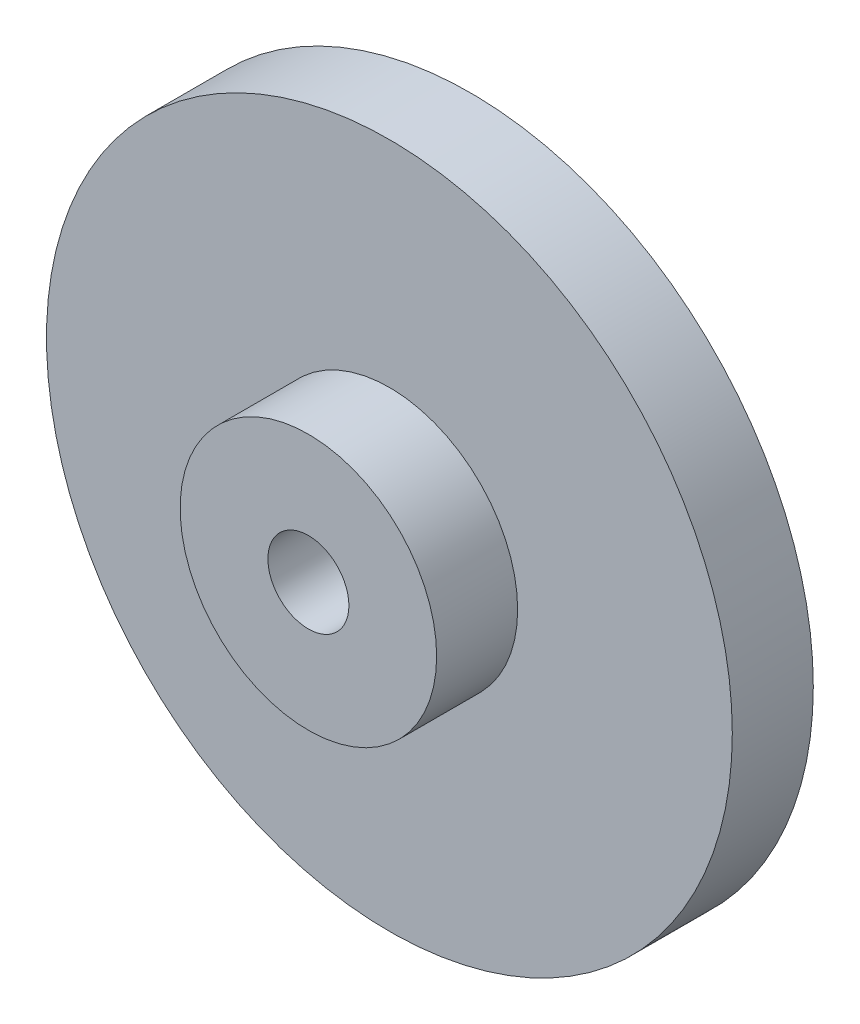
ISO-10303-21;
HEADER;
FILE_DESCRIPTION(('STEP AP214'),'2;1');
FILE_NAME('part.step','',(''),(''),'','','');
FILE_SCHEMA(('AUTOMOTIVE_DESIGN { 1 0 10303 214 1 1 1 1 }'));
ENDSEC;
DATA;
#1=APPLICATION_CONTEXT('core data for automotive mechanical design processes');
#2=APPLICATION_PROTOCOL_DEFINITION('international standard','automotive_design',2000,#1);
#3=PRODUCT_CONTEXT('',#1,'mechanical');
#4=PRODUCT('Part','Part','',(#3));
#5=PRODUCT_RELATED_PRODUCT_CATEGORY('part','',(#4));
#6=PRODUCT_DEFINITION_FORMATION('','',#4);
#7=PRODUCT_DEFINITION_CONTEXT('part definition',#1,'design');
#8=PRODUCT_DEFINITION('design','',#6,#7);
#9=PRODUCT_DEFINITION_SHAPE('','',#8);
#10=(LENGTH_UNIT() NAMED_UNIT(*) SI_UNIT(.MILLI.,.METRE.));
#11=(NAMED_UNIT(*) PLANE_ANGLE_UNIT() SI_UNIT($,.RADIAN.));
#12=(NAMED_UNIT(*) SI_UNIT($,.STERADIAN.) SOLID_ANGLE_UNIT());
#13=UNCERTAINTY_MEASURE_WITH_UNIT(LENGTH_MEASURE(1.E-05),#10,'distance_accuracy_value','');
#14=(GEOMETRIC_REPRESENTATION_CONTEXT(3) GLOBAL_UNCERTAINTY_ASSIGNED_CONTEXT((#13)) GLOBAL_UNIT_ASSIGNED_CONTEXT((#10,
#11,#12)) REPRESENTATION_CONTEXT('',''));
#15=CARTESIAN_POINT('',(0.,0.,0.));
#16=DIRECTION('',(0.,0.,1.));
#17=DIRECTION('',(1.,0.,0.));
#18=AXIS2_PLACEMENT_3D('',#15,#16,#17);
#19=CARTESIAN_POINT('',(0.,0.,6.));
#20=DIRECTION('',(0.,0.,-1.));
#21=DIRECTION('',(-1.,0.,0.));
#22=AXIS2_PLACEMENT_3D('',#19,#20,#21);
#23=CYLINDRICAL_SURFACE('',#22,25.4);
#24=CARTESIAN_POINT('',(0.,0.,6.));
#25=DIRECTION('',(0.,0.,1.));
#26=DIRECTION('',(1.,0.,0.));
#27=AXIS2_PLACEMENT_3D('',#24,#25,#26);
#28=CIRCLE('',#27,25.4);
#29=CARTESIAN_POINT('',(25.4,0.,6.));
#30=VERTEX_POINT('',#29);
#31=EDGE_CURVE('E38',#30,#30,#28,.T.);
#32=ORIENTED_EDGE('',*,*,#31,.F.);
#33=EDGE_LOOP('',(#32));
#34=FACE_BOUND('',#33,.T.);
#35=CARTESIAN_POINT('',(0.,0.,0.));
#36=DIRECTION('',(0.,0.,1.));
#37=DIRECTION('',(1.,0.,0.));
#38=AXIS2_PLACEMENT_3D('',#35,#36,#37);
#39=CIRCLE('',#38,25.4);
#40=CARTESIAN_POINT('',(25.4,0.,0.));
#41=VERTEX_POINT('',#40);
#42=EDGE_CURVE('E34',#41,#41,#39,.T.);
#43=ORIENTED_EDGE('',*,*,#42,.T.);
#44=EDGE_LOOP('',(#43));
#45=FACE_BOUND('',#44,.T.);
#46=ADVANCED_FACE('F31',(#34,#45),#23,.T.);
#47=CARTESIAN_POINT('',(0.,0.,6.));
#48=DIRECTION('',(0.,0.,1.));
#49=DIRECTION('',(1.,0.,0.));
#50=AXIS2_PLACEMENT_3D('',#47,#48,#49);
#51=PLANE('',#50);
#52=CARTESIAN_POINT('',(0.,0.,6.));
#53=DIRECTION('',(0.,0.,1.));
#54=DIRECTION('',(1.,0.,0.));
#55=AXIS2_PLACEMENT_3D('',#52,#53,#54);
#56=CIRCLE('',#55,9.5);
#57=CARTESIAN_POINT('',(9.5,0.,6.));
#58=VERTEX_POINT('',#57);
#59=EDGE_CURVE('E10',#58,#58,#56,.T.);
#60=ORIENTED_EDGE('',*,*,#59,.F.);
#61=EDGE_LOOP('',(#60));
#62=FACE_BOUND('',#61,.T.);
#63=ORIENTED_EDGE('',*,*,#31,.T.);
#64=EDGE_LOOP('',(#63));
#65=FACE_BOUND('',#64,.T.);
#66=ADVANCED_FACE('F69',(#62,#65),#51,.T.);
#67=CARTESIAN_POINT('',(0.,0.,0.));
#68=DIRECTION('',(0.,0.,1.));
#69=DIRECTION('',(1.,0.,0.));
#70=AXIS2_PLACEMENT_3D('',#67,#68,#69);
#71=PLANE('',#70);
#72=CARTESIAN_POINT('',(0.,0.,0.));
#73=DIRECTION('',(0.,0.,1.));
#74=DIRECTION('',(1.,0.,0.));
#75=AXIS2_PLACEMENT_3D('',#72,#73,#74);
#76=CIRCLE('',#75,3.);
#77=CARTESIAN_POINT('',(3.,0.,0.));
#78=VERTEX_POINT('',#77);
#79=EDGE_CURVE('E50',#78,#78,#76,.T.);
#80=ORIENTED_EDGE('',*,*,#79,.T.);
#81=EDGE_LOOP('',(#80));
#82=FACE_BOUND('',#81,.T.);
#83=ORIENTED_EDGE('',*,*,#42,.F.);
#84=EDGE_LOOP('',(#83));
#85=FACE_BOUND('',#84,.T.);
#86=ADVANCED_FACE('F54',(#82,#85),#71,.F.);
#87=CARTESIAN_POINT('',(0.,0.,12.));
#88=DIRECTION('',(0.,0.,-1.));
#89=DIRECTION('',(-1.,0.,0.));
#90=AXIS2_PLACEMENT_3D('',#87,#88,#89);
#91=CYLINDRICAL_SURFACE('',#90,9.5);
#92=CARTESIAN_POINT('',(0.,0.,12.));
#93=DIRECTION('',(0.,0.,1.));
#94=DIRECTION('',(1.,0.,0.));
#95=AXIS2_PLACEMENT_3D('',#92,#93,#94);
#96=CIRCLE('',#95,9.5);
#97=CARTESIAN_POINT('',(9.5,0.,12.));
#98=VERTEX_POINT('',#97);
#99=EDGE_CURVE('E44',#98,#98,#96,.T.);
#100=ORIENTED_EDGE('',*,*,#99,.F.);
#101=EDGE_LOOP('',(#100));
#102=FACE_BOUND('',#101,.T.);
#103=ORIENTED_EDGE('',*,*,#59,.T.);
#104=EDGE_LOOP('',(#103));
#105=FACE_BOUND('',#104,.T.);
#106=ADVANCED_FACE('F65',(#102,#105),#91,.T.);
#107=CARTESIAN_POINT('',(0.,0.,12.));
#108=DIRECTION('',(0.,0.,1.));
#109=DIRECTION('',(1.,0.,0.));
#110=AXIS2_PLACEMENT_3D('',#107,#108,#109);
#111=PLANE('',#110);
#112=CARTESIAN_POINT('',(0.,0.,12.));
#113=DIRECTION('',(0.,0.,1.));
#114=DIRECTION('',(1.,0.,0.));
#115=AXIS2_PLACEMENT_3D('',#112,#113,#114);
#116=CIRCLE('',#115,3.);
#117=CARTESIAN_POINT('',(3.,0.,12.));
#118=VERTEX_POINT('',#117);
#119=EDGE_CURVE('E47',#118,#118,#116,.T.);
#120=ORIENTED_EDGE('',*,*,#119,.F.);
#121=EDGE_LOOP('',(#120));
#122=FACE_BOUND('',#121,.T.);
#123=ORIENTED_EDGE('',*,*,#99,.T.);
#124=EDGE_LOOP('',(#123));
#125=FACE_BOUND('',#124,.T.);
#126=ADVANCED_FACE('F59',(#122,#125),#111,.T.);
#127=CARTESIAN_POINT('',(0.,0.,12.001));
#128=DIRECTION('',(0.,0.,-1.));
#129=DIRECTION('',(-1.,0.,0.));
#130=AXIS2_PLACEMENT_3D('',#127,#128,#129);
#131=CYLINDRICAL_SURFACE('',#130,3.);
#132=ORIENTED_EDGE('',*,*,#119,.T.);
#133=EDGE_LOOP('',(#132));
#134=FACE_BOUND('',#133,.T.);
#135=ORIENTED_EDGE('',*,*,#79,.F.);
#136=EDGE_LOOP('',(#135));
#137=FACE_BOUND('',#136,.T.);
#138=ADVANCED_FACE('F57',(#134,#137),#131,.F.);
#139=CLOSED_SHELL('',(#46,#66,#86,#106,#126,#138));
#140=MANIFOLD_SOLID_BREP('B2',#139);
#141=ADVANCED_BREP_SHAPE_REPRESENTATION('',(#18,#140),#14);
#142=SHAPE_DEFINITION_REPRESENTATION(#9,#141);
ENDSEC;
END-ISO-10303-21;
